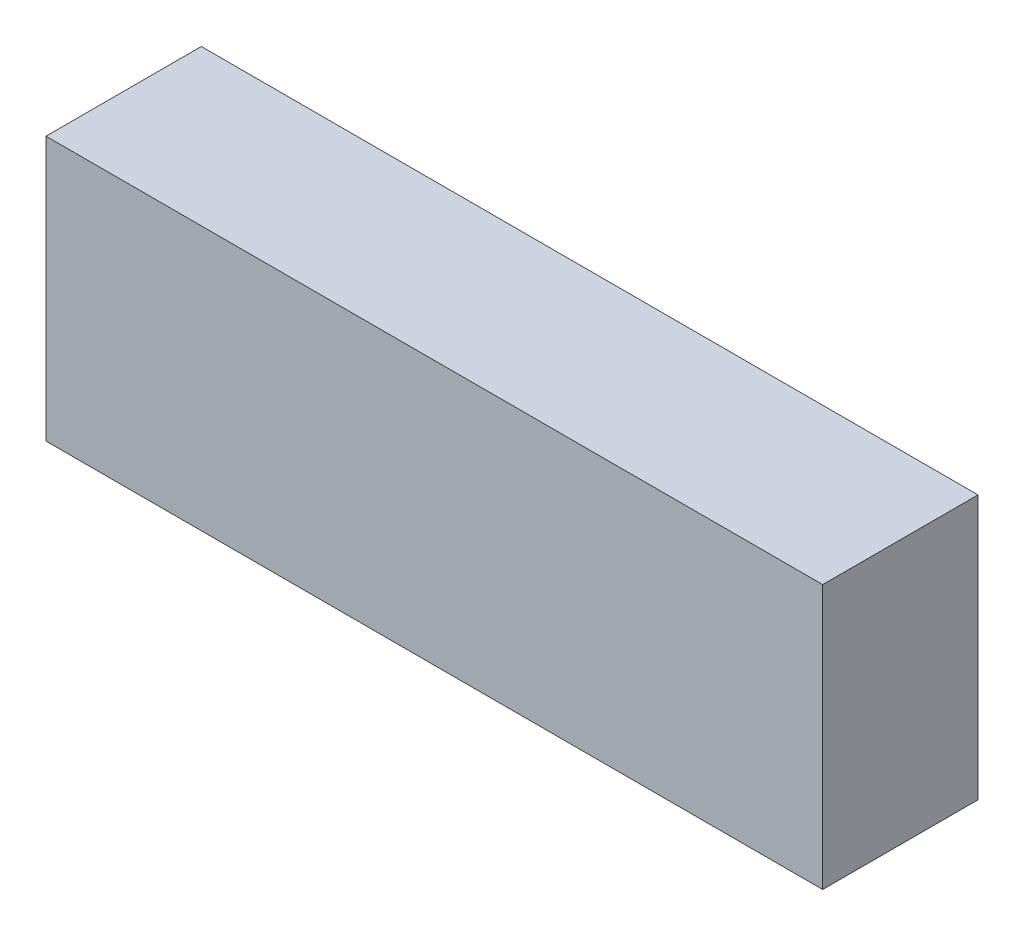
ISO-10303-21;
HEADER;
FILE_DESCRIPTION(('STEP AP214'),'2;1');
FILE_NAME('part.step','',(''),(''),'','','');
FILE_SCHEMA(('AUTOMOTIVE_DESIGN { 1 0 10303 214 1 1 1 1 }'));
ENDSEC;
DATA;
#1=APPLICATION_CONTEXT('core data for automotive mechanical design processes');
#2=APPLICATION_PROTOCOL_DEFINITION('international standard','automotive_design',2000,#1);
#3=PRODUCT_CONTEXT('',#1,'mechanical');
#4=PRODUCT('Part','Part','',(#3));
#5=PRODUCT_RELATED_PRODUCT_CATEGORY('part','',(#4));
#6=PRODUCT_DEFINITION_FORMATION('','',#4);
#7=PRODUCT_DEFINITION_CONTEXT('part definition',#1,'design');
#8=PRODUCT_DEFINITION('design','',#6,#7);
#9=PRODUCT_DEFINITION_SHAPE('','',#8);
#10=(LENGTH_UNIT() NAMED_UNIT(*) SI_UNIT(.MILLI.,.METRE.));
#11=(NAMED_UNIT(*) PLANE_ANGLE_UNIT() SI_UNIT($,.RADIAN.));
#12=(NAMED_UNIT(*) SI_UNIT($,.STERADIAN.) SOLID_ANGLE_UNIT());
#13=UNCERTAINTY_MEASURE_WITH_UNIT(LENGTH_MEASURE(1.E-05),#10,'distance_accuracy_value','');
#14=(GEOMETRIC_REPRESENTATION_CONTEXT(3) GLOBAL_UNCERTAINTY_ASSIGNED_CONTEXT((#13)) GLOBAL_UNIT_ASSIGNED_CONTEXT((#10,
#11,#12)) REPRESENTATION_CONTEXT('',''));
#15=CARTESIAN_POINT('',(0.,0.,0.));
#16=DIRECTION('',(0.,0.,1.));
#17=DIRECTION('',(1.,0.,0.));
#18=AXIS2_PLACEMENT_3D('',#15,#16,#17);
#19=CARTESIAN_POINT('',(25.,-8.5,5.));
#20=DIRECTION('',(-1.,0.,0.));
#21=DIRECTION('',(0.,0.,1.));
#22=AXIS2_PLACEMENT_3D('',#19,#20,#21);
#23=PLANE('',#22);
#24=DIRECTION('',(0.,1.,0.));
#25=VECTOR('',#24,1.);
#26=CARTESIAN_POINT('',(25.,-8.5,-5.));
#27=LINE('',#26,#25);
#28=CARTESIAN_POINT('',(25.,-8.5,-5.));
#29=VERTEX_POINT('',#28);
#30=CARTESIAN_POINT('',(25.,8.5,-5.));
#31=VERTEX_POINT('',#30);
#32=EDGE_CURVE('E113',#29,#31,#27,.T.);
#33=ORIENTED_EDGE('',*,*,#32,.T.);
#34=DIRECTION('',(0.,0.,-1.));
#35=VECTOR('',#34,1.);
#36=CARTESIAN_POINT('',(25.,8.5,5.));
#37=LINE('',#36,#35);
#38=CARTESIAN_POINT('',(25.,8.5,5.));
#39=VERTEX_POINT('',#38);
#40=EDGE_CURVE('E11',#39,#31,#37,.T.);
#41=ORIENTED_EDGE('',*,*,#40,.F.);
#42=DIRECTION('',(0.,1.,0.));
#43=VECTOR('',#42,1.);
#44=CARTESIAN_POINT('',(25.,-8.5,5.));
#45=LINE('',#44,#43);
#46=CARTESIAN_POINT('',(25.,-8.5,5.));
#47=VERTEX_POINT('',#46);
#48=EDGE_CURVE('E97',#47,#39,#45,.T.);
#49=ORIENTED_EDGE('',*,*,#48,.F.);
#50=DIRECTION('',(0.,0.,-1.));
#51=VECTOR('',#50,1.);
#52=CARTESIAN_POINT('',(25.,-8.5,5.));
#53=LINE('',#52,#51);
#54=EDGE_CURVE('E109',#47,#29,#53,.T.);
#55=ORIENTED_EDGE('',*,*,#54,.T.);
#56=EDGE_LOOP('',(#33,#41,#49,#55));
#57=FACE_BOUND('',#56,.T.);
#58=ADVANCED_FACE('F45',(#57),#23,.F.);
#59=CARTESIAN_POINT('',(-25.,8.5,5.));
#60=DIRECTION('',(0.,-1.,0.));
#61=DIRECTION('',(0.,0.,-1.));
#62=AXIS2_PLACEMENT_3D('',#59,#60,#61);
#63=PLANE('',#62);
#64=DIRECTION('',(-1.,0.,0.));
#65=VECTOR('',#64,1.);
#66=CARTESIAN_POINT('',(-25.,8.5,-5.));
#67=LINE('',#66,#65);
#68=CARTESIAN_POINT('',(-25.,8.5,-5.));
#69=VERTEX_POINT('',#68);
#70=EDGE_CURVE('E102',#31,#69,#67,.T.);
#71=ORIENTED_EDGE('',*,*,#70,.T.);
#72=DIRECTION('',(0.,0.,-1.));
#73=VECTOR('',#72,1.);
#74=CARTESIAN_POINT('',(-25.,8.5,5.));
#75=LINE('',#74,#73);
#76=CARTESIAN_POINT('',(-25.,8.5,5.));
#77=VERTEX_POINT('',#76);
#78=EDGE_CURVE('E54',#77,#69,#75,.T.);
#79=ORIENTED_EDGE('',*,*,#78,.F.);
#80=DIRECTION('',(-1.,0.,0.));
#81=VECTOR('',#80,1.);
#82=CARTESIAN_POINT('',(-25.,8.5,5.));
#83=LINE('',#82,#81);
#84=EDGE_CURVE('E92',#39,#77,#83,.T.);
#85=ORIENTED_EDGE('',*,*,#84,.F.);
#86=ORIENTED_EDGE('',*,*,#40,.T.);
#87=EDGE_LOOP('',(#71,#79,#85,#86));
#88=FACE_BOUND('',#87,.T.);
#89=ADVANCED_FACE('F101',(#88),#63,.F.);
#90=CARTESIAN_POINT('',(-25.,-8.5,5.));
#91=DIRECTION('',(1.,0.,0.));
#92=DIRECTION('',(0.,0.,-1.));
#93=AXIS2_PLACEMENT_3D('',#90,#91,#92);
#94=PLANE('',#93);
#95=DIRECTION('',(0.,-1.,0.));
#96=VECTOR('',#95,1.);
#97=CARTESIAN_POINT('',(-25.,-8.5,-5.));
#98=LINE('',#97,#96);
#99=CARTESIAN_POINT('',(-25.,-8.5,-5.));
#100=VERTEX_POINT('',#99);
#101=EDGE_CURVE('E79',#69,#100,#98,.T.);
#102=ORIENTED_EDGE('',*,*,#101,.T.);
#103=DIRECTION('',(0.,0.,-1.));
#104=VECTOR('',#103,1.);
#105=CARTESIAN_POINT('',(-25.,-8.5,5.));
#106=LINE('',#105,#104);
#107=CARTESIAN_POINT('',(-25.,-8.5,5.));
#108=VERTEX_POINT('',#107);
#109=EDGE_CURVE('E104',#108,#100,#106,.T.);
#110=ORIENTED_EDGE('',*,*,#109,.F.);
#111=DIRECTION('',(0.,-1.,0.));
#112=VECTOR('',#111,1.);
#113=CARTESIAN_POINT('',(-25.,-8.5,5.));
#114=LINE('',#113,#112);
#115=EDGE_CURVE('E95',#77,#108,#114,.T.);
#116=ORIENTED_EDGE('',*,*,#115,.F.);
#117=ORIENTED_EDGE('',*,*,#78,.T.);
#118=EDGE_LOOP('',(#102,#110,#116,#117));
#119=FACE_BOUND('',#118,.T.);
#120=ADVANCED_FACE('F105',(#119),#94,.F.);
#121=CARTESIAN_POINT('',(-25.,-8.5,5.));
#122=DIRECTION('',(0.,1.,0.));
#123=DIRECTION('',(0.,0.,1.));
#124=AXIS2_PLACEMENT_3D('',#121,#122,#123);
#125=PLANE('',#124);
#126=DIRECTION('',(1.,0.,0.));
#127=VECTOR('',#126,1.);
#128=CARTESIAN_POINT('',(-25.,-8.5,-5.));
#129=LINE('',#128,#127);
#130=EDGE_CURVE('E85',#100,#29,#129,.T.);
#131=ORIENTED_EDGE('',*,*,#130,.T.);
#132=ORIENTED_EDGE('',*,*,#54,.F.);
#133=DIRECTION('',(1.,0.,0.));
#134=VECTOR('',#133,1.);
#135=CARTESIAN_POINT('',(-25.,-8.5,5.));
#136=LINE('',#135,#134);
#137=EDGE_CURVE('E62',#108,#47,#136,.T.);
#138=ORIENTED_EDGE('',*,*,#137,.F.);
#139=ORIENTED_EDGE('',*,*,#109,.T.);
#140=EDGE_LOOP('',(#131,#132,#138,#139));
#141=FACE_BOUND('',#140,.T.);
#142=ADVANCED_FACE('F126',(#141),#125,.F.);
#143=CARTESIAN_POINT('',(0.,0.,5.));
#144=DIRECTION('',(0.,0.,-1.));
#145=DIRECTION('',(-1.,0.,0.));
#146=AXIS2_PLACEMENT_3D('',#143,#144,#145);
#147=PLANE('',#146);
#148=ORIENTED_EDGE('',*,*,#48,.T.);
#149=ORIENTED_EDGE('',*,*,#84,.T.);
#150=ORIENTED_EDGE('',*,*,#115,.T.);
#151=ORIENTED_EDGE('',*,*,#137,.T.);
#152=EDGE_LOOP('',(#148,#149,#150,#151));
#153=FACE_BOUND('',#152,.T.);
#154=ADVANCED_FACE('F93',(#153),#147,.F.);
#155=CARTESIAN_POINT('',(0.,0.,-5.));
#156=DIRECTION('',(0.,0.,-1.));
#157=DIRECTION('',(-1.,0.,0.));
#158=AXIS2_PLACEMENT_3D('',#155,#156,#157);
#159=PLANE('',#158);
#160=ORIENTED_EDGE('',*,*,#32,.F.);
#161=ORIENTED_EDGE('',*,*,#130,.F.);
#162=ORIENTED_EDGE('',*,*,#101,.F.);
#163=ORIENTED_EDGE('',*,*,#70,.F.);
#164=EDGE_LOOP('',(#160,#161,#162,#163));
#165=FACE_BOUND('',#164,.T.);
#166=ADVANCED_FACE('F129',(#165),#159,.T.);
#167=CLOSED_SHELL('',(#58,#89,#120,#142,#154,#166));
#168=MANIFOLD_SOLID_BREP('B2',#167);
#169=ADVANCED_BREP_SHAPE_REPRESENTATION('',(#18,#168),#14);
#170=SHAPE_DEFINITION_REPRESENTATION(#9,#169);
ENDSEC;
END-ISO-10303-21;
